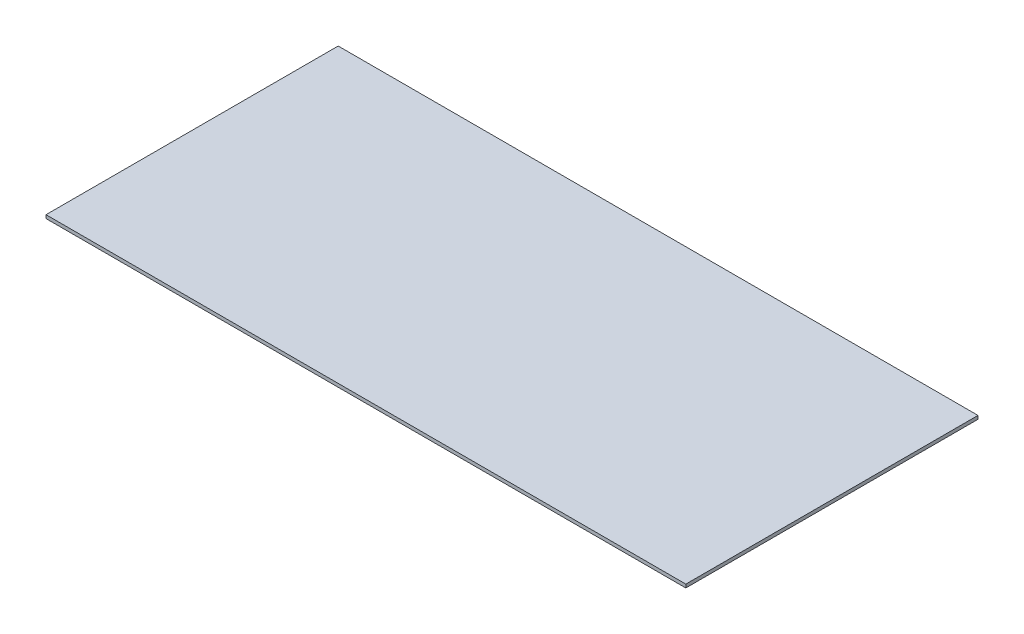
ISO-10303-21;
HEADER;
FILE_DESCRIPTION(('STEP AP214'),'2;1');
FILE_NAME('part.step','',(''),(''),'','','');
FILE_SCHEMA(('AUTOMOTIVE_DESIGN { 1 0 10303 214 1 1 1 1 }'));
ENDSEC;
DATA;
#1=APPLICATION_CONTEXT('core data for automotive mechanical design processes');
#2=APPLICATION_PROTOCOL_DEFINITION('international standard','automotive_design',2000,#1);
#3=PRODUCT_CONTEXT('',#1,'mechanical');
#4=PRODUCT('Part','Part','',(#3));
#5=PRODUCT_RELATED_PRODUCT_CATEGORY('part','',(#4));
#6=PRODUCT_DEFINITION_FORMATION('','',#4);
#7=PRODUCT_DEFINITION_CONTEXT('part definition',#1,'design');
#8=PRODUCT_DEFINITION('design','',#6,#7);
#9=PRODUCT_DEFINITION_SHAPE('','',#8);
#10=(LENGTH_UNIT() NAMED_UNIT(*) SI_UNIT(.MILLI.,.METRE.));
#11=(NAMED_UNIT(*) PLANE_ANGLE_UNIT() SI_UNIT($,.RADIAN.));
#12=(NAMED_UNIT(*) SI_UNIT($,.STERADIAN.) SOLID_ANGLE_UNIT());
#13=UNCERTAINTY_MEASURE_WITH_UNIT(LENGTH_MEASURE(1.E-05),#10,'distance_accuracy_value','');
#14=(GEOMETRIC_REPRESENTATION_CONTEXT(3) GLOBAL_UNCERTAINTY_ASSIGNED_CONTEXT((#13)) GLOBAL_UNIT_ASSIGNED_CONTEXT((#10,
#11,#12)) REPRESENTATION_CONTEXT('',''));
#15=CARTESIAN_POINT('',(0.,0.,0.));
#16=DIRECTION('',(0.,0.,1.));
#17=DIRECTION('',(1.,0.,0.));
#18=AXIS2_PLACEMENT_3D('',#15,#16,#17);
#19=CARTESIAN_POINT('',(-9955.5238095238,5.,-4166.90476190476));
#20=DIRECTION('',(1.,0.,0.));
#21=DIRECTION('',(0.,0.,-1.));
#22=AXIS2_PLACEMENT_3D('',#19,#20,#21);
#23=PLANE('',#22);
#24=DIRECTION('',(0.,0.,1.));
#25=VECTOR('',#24,1.);
#26=CARTESIAN_POINT('',(-9955.5238095238,0.,-4166.90476190476));
#27=LINE('',#26,#25);
#28=CARTESIAN_POINT('',(-9955.5238095238,0.,-4166.90476190476));
#29=VERTEX_POINT('',#28);
#30=CARTESIAN_POINT('',(-9955.5238095238,0.,-3734.90476190476));
#31=VERTEX_POINT('',#30);
#32=EDGE_CURVE('E98',#29,#31,#27,.T.);
#33=ORIENTED_EDGE('',*,*,#32,.T.);
#34=DIRECTION('',(0.,-1.,0.));
#35=VECTOR('',#34,1.);
#36=CARTESIAN_POINT('',(-9955.5238095238,5.,-3734.90476190476));
#37=LINE('',#36,#35);
#38=CARTESIAN_POINT('',(-9955.5238095238,5.,-3734.90476190476));
#39=VERTEX_POINT('',#38);
#40=EDGE_CURVE('E11',#39,#31,#37,.T.);
#41=ORIENTED_EDGE('',*,*,#40,.F.);
#42=DIRECTION('',(0.,0.,1.));
#43=VECTOR('',#42,1.);
#44=CARTESIAN_POINT('',(-9955.5238095238,5.,-4166.90476190476));
#45=LINE('',#44,#43);
#46=CARTESIAN_POINT('',(-9955.5238095238,5.,-4166.90476190476));
#47=VERTEX_POINT('',#46);
#48=EDGE_CURVE('E86',#47,#39,#45,.T.);
#49=ORIENTED_EDGE('',*,*,#48,.F.);
#50=DIRECTION('',(0.,-1.,0.));
#51=VECTOR('',#50,1.);
#52=CARTESIAN_POINT('',(-9955.5238095238,5.,-4166.90476190476));
#53=LINE('',#52,#51);
#54=EDGE_CURVE('E94',#47,#29,#53,.T.);
#55=ORIENTED_EDGE('',*,*,#54,.T.);
#56=EDGE_LOOP('',(#33,#41,#49,#55));
#57=FACE_BOUND('',#56,.T.);
#58=ADVANCED_FACE('F35',(#57),#23,.F.);
#59=CARTESIAN_POINT('',(-9955.5238095238,5.,-3734.90476190476));
#60=DIRECTION('',(0.,0.,-1.));
#61=DIRECTION('',(-1.,0.,0.));
#62=AXIS2_PLACEMENT_3D('',#59,#60,#61);
#63=PLANE('',#62);
#64=DIRECTION('',(1.,0.,0.));
#65=VECTOR('',#64,1.);
#66=CARTESIAN_POINT('',(-9955.5238095238,0.,-3734.90476190476));
#67=LINE('',#66,#65);
#68=CARTESIAN_POINT('',(-9009.5238095238,0.,-3734.90476190476));
#69=VERTEX_POINT('',#68);
#70=EDGE_CURVE('E90',#31,#69,#67,.T.);
#71=ORIENTED_EDGE('',*,*,#70,.T.);
#72=DIRECTION('',(0.,-1.,0.));
#73=VECTOR('',#72,1.);
#74=CARTESIAN_POINT('',(-9009.5238095238,5.,-3734.90476190476));
#75=LINE('',#74,#73);
#76=CARTESIAN_POINT('',(-9009.5238095238,5.,-3734.90476190476));
#77=VERTEX_POINT('',#76);
#78=EDGE_CURVE('E43',#77,#69,#75,.T.);
#79=ORIENTED_EDGE('',*,*,#78,.F.);
#80=DIRECTION('',(1.,0.,0.));
#81=VECTOR('',#80,1.);
#82=CARTESIAN_POINT('',(-9955.5238095238,5.,-3734.90476190476));
#83=LINE('',#82,#81);
#84=EDGE_CURVE('E81',#39,#77,#83,.T.);
#85=ORIENTED_EDGE('',*,*,#84,.F.);
#86=ORIENTED_EDGE('',*,*,#40,.T.);
#87=EDGE_LOOP('',(#71,#79,#85,#86));
#88=FACE_BOUND('',#87,.T.);
#89=ADVANCED_FACE('F89',(#88),#63,.F.);
#90=CARTESIAN_POINT('',(-9009.5238095238,5.,-4166.90476190476));
#91=DIRECTION('',(-1.,0.,0.));
#92=DIRECTION('',(0.,0.,1.));
#93=AXIS2_PLACEMENT_3D('',#90,#91,#92);
#94=PLANE('',#93);
#95=DIRECTION('',(0.,0.,-1.));
#96=VECTOR('',#95,1.);
#97=CARTESIAN_POINT('',(-9009.5238095238,0.,-4166.90476190476));
#98=LINE('',#97,#96);
#99=CARTESIAN_POINT('',(-9009.5238095238,0.,-4166.90476190476));
#100=VERTEX_POINT('',#99);
#101=EDGE_CURVE('E68',#69,#100,#98,.T.);
#102=ORIENTED_EDGE('',*,*,#101,.T.);
#103=DIRECTION('',(0.,-1.,0.));
#104=VECTOR('',#103,1.);
#105=CARTESIAN_POINT('',(-9009.5238095238,5.,-4166.90476190476));
#106=LINE('',#105,#104);
#107=CARTESIAN_POINT('',(-9009.5238095238,5.,-4166.90476190476));
#108=VERTEX_POINT('',#107);
#109=EDGE_CURVE('E91',#108,#100,#106,.T.);
#110=ORIENTED_EDGE('',*,*,#109,.F.);
#111=DIRECTION('',(0.,0.,-1.));
#112=VECTOR('',#111,1.);
#113=CARTESIAN_POINT('',(-9009.5238095238,5.,-4166.90476190476));
#114=LINE('',#113,#112);
#115=EDGE_CURVE('E84',#77,#108,#114,.T.);
#116=ORIENTED_EDGE('',*,*,#115,.F.);
#117=ORIENTED_EDGE('',*,*,#78,.T.);
#118=EDGE_LOOP('',(#102,#110,#116,#117));
#119=FACE_BOUND('',#118,.T.);
#120=ADVANCED_FACE('F92',(#119),#94,.F.);
#121=CARTESIAN_POINT('',(-9955.5238095238,5.,-4166.90476190476));
#122=DIRECTION('',(0.,0.,1.));
#123=DIRECTION('',(1.,0.,0.));
#124=AXIS2_PLACEMENT_3D('',#121,#122,#123);
#125=PLANE('',#124);
#126=DIRECTION('',(-1.,0.,0.));
#127=VECTOR('',#126,1.);
#128=CARTESIAN_POINT('',(-9955.5238095238,0.,-4166.90476190476));
#129=LINE('',#128,#127);
#130=EDGE_CURVE('E74',#100,#29,#129,.T.);
#131=ORIENTED_EDGE('',*,*,#130,.T.);
#132=ORIENTED_EDGE('',*,*,#54,.F.);
#133=DIRECTION('',(-1.,0.,0.));
#134=VECTOR('',#133,1.);
#135=CARTESIAN_POINT('',(-9955.5238095238,5.,-4166.90476190476));
#136=LINE('',#135,#134);
#137=EDGE_CURVE('E51',#108,#47,#136,.T.);
#138=ORIENTED_EDGE('',*,*,#137,.F.);
#139=ORIENTED_EDGE('',*,*,#109,.T.);
#140=EDGE_LOOP('',(#131,#132,#138,#139));
#141=FACE_BOUND('',#140,.T.);
#142=ADVANCED_FACE('F105',(#141),#125,.F.);
#143=CARTESIAN_POINT('',(0.,5.,0.));
#144=DIRECTION('',(0.,1.,0.));
#145=DIRECTION('',(0.,0.,1.));
#146=AXIS2_PLACEMENT_3D('',#143,#144,#145);
#147=PLANE('',#146);
#148=ORIENTED_EDGE('',*,*,#48,.T.);
#149=ORIENTED_EDGE('',*,*,#84,.T.);
#150=ORIENTED_EDGE('',*,*,#115,.T.);
#151=ORIENTED_EDGE('',*,*,#137,.T.);
#152=EDGE_LOOP('',(#148,#149,#150,#151));
#153=FACE_BOUND('',#152,.T.);
#154=ADVANCED_FACE('F82',(#153),#147,.T.);
#155=CARTESIAN_POINT('',(0.,0.,0.));
#156=DIRECTION('',(0.,1.,0.));
#157=DIRECTION('',(0.,0.,1.));
#158=AXIS2_PLACEMENT_3D('',#155,#156,#157);
#159=PLANE('',#158);
#160=ORIENTED_EDGE('',*,*,#32,.F.);
#161=ORIENTED_EDGE('',*,*,#130,.F.);
#162=ORIENTED_EDGE('',*,*,#101,.F.);
#163=ORIENTED_EDGE('',*,*,#70,.F.);
#164=EDGE_LOOP('',(#160,#161,#162,#163));
#165=FACE_BOUND('',#164,.T.);
#166=ADVANCED_FACE('F108',(#165),#159,.F.);
#167=CLOSED_SHELL('',(#58,#89,#120,#142,#154,#166));
#168=MANIFOLD_SOLID_BREP('B2',#167);
#169=ADVANCED_BREP_SHAPE_REPRESENTATION('',(#18,#168),#14);
#170=SHAPE_DEFINITION_REPRESENTATION(#9,#169);
ENDSEC;
END-ISO-10303-21;
